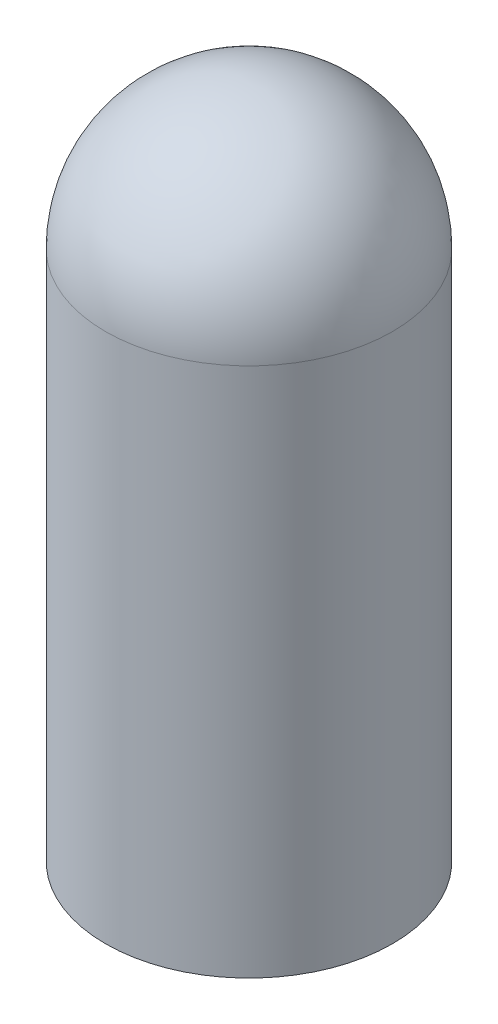
ISO-10303-21;
HEADER;
FILE_DESCRIPTION(('STEP AP214'),'2;1');
FILE_NAME('part.step','',(''),(''),'','','');
FILE_SCHEMA(('AUTOMOTIVE_DESIGN { 1 0 10303 214 1 1 1 1 }'));
ENDSEC;
DATA;
#1=APPLICATION_CONTEXT('core data for automotive mechanical design processes');
#2=APPLICATION_PROTOCOL_DEFINITION('international standard','automotive_design',2000,#1);
#3=PRODUCT_CONTEXT('',#1,'mechanical');
#4=PRODUCT('Part','Part','',(#3));
#5=PRODUCT_RELATED_PRODUCT_CATEGORY('part','',(#4));
#6=PRODUCT_DEFINITION_FORMATION('','',#4);
#7=PRODUCT_DEFINITION_CONTEXT('part definition',#1,'design');
#8=PRODUCT_DEFINITION('design','',#6,#7);
#9=PRODUCT_DEFINITION_SHAPE('','',#8);
#10=(LENGTH_UNIT() NAMED_UNIT(*) SI_UNIT(.MILLI.,.METRE.));
#11=(NAMED_UNIT(*) PLANE_ANGLE_UNIT() SI_UNIT($,.RADIAN.));
#12=(NAMED_UNIT(*) SI_UNIT($,.STERADIAN.) SOLID_ANGLE_UNIT());
#13=UNCERTAINTY_MEASURE_WITH_UNIT(LENGTH_MEASURE(1.E-05),#10,'distance_accuracy_value','');
#14=(GEOMETRIC_REPRESENTATION_CONTEXT(3) GLOBAL_UNCERTAINTY_ASSIGNED_CONTEXT((#13)) GLOBAL_UNIT_ASSIGNED_CONTEXT((#10,
#11,#12)) REPRESENTATION_CONTEXT('',''));
#15=CARTESIAN_POINT('',(0.,0.,0.));
#16=DIRECTION('',(0.,0.,1.));
#17=DIRECTION('',(1.,0.,0.));
#18=AXIS2_PLACEMENT_3D('',#15,#16,#17);
#19=CARTESIAN_POINT('',(288.897078471881,156.366473187338,0.));
#20=DIRECTION('',(0.,-1.,0.));
#21=DIRECTION('',(1.,0.,0.));
#22=AXIS2_PLACEMENT_3D('',#19,#20,#21);
#23=CYLINDRICAL_SURFACE('',#22,73.025);
#24=CARTESIAN_POINT('',(288.897078471881,426.241473187338,0.));
#25=DIRECTION('',(0.,-1.,0.));
#26=DIRECTION('',(1.,0.,0.));
#27=AXIS2_PLACEMENT_3D('',#24,#25,#26);
#28=CIRCLE('',#27,73.025);
#29=CARTESIAN_POINT('',(361.922078471881,426.241473187338,0.));
#30=VERTEX_POINT('',#29);
#31=EDGE_CURVE('E11',#30,#30,#28,.T.);
#32=ORIENTED_EDGE('',*,*,#31,.T.);
#33=EDGE_LOOP('',(#32));
#34=FACE_BOUND('',#33,.T.);
#35=CARTESIAN_POINT('',(288.897078471881,156.366473187338,0.));
#36=DIRECTION('',(0.,-1.,0.));
#37=DIRECTION('',(1.,0.,0.));
#38=AXIS2_PLACEMENT_3D('',#35,#36,#37);
#39=CIRCLE('',#38,73.025);
#40=CARTESIAN_POINT('',(361.922078471881,156.366473187338,0.));
#41=VERTEX_POINT('',#40);
#42=EDGE_CURVE('E44',#41,#41,#39,.T.);
#43=ORIENTED_EDGE('',*,*,#42,.F.);
#44=EDGE_LOOP('',(#43));
#45=FACE_BOUND('',#44,.T.);
#46=ADVANCED_FACE('F37',(#34,#45),#23,.T.);
#47=CARTESIAN_POINT('',(288.897078471881,426.241473187338,0.));
#48=DIRECTION('',(0.,-1.,0.));
#49=DIRECTION('',(1.,0.,0.));
#50=AXIS2_PLACEMENT_3D('',#47,#48,#49);
#51=SPHERICAL_SURFACE('',#50,73.025);
#52=ORIENTED_EDGE('',*,*,#31,.F.);
#53=EDGE_LOOP('',(#52));
#54=FACE_BOUND('',#53,.T.);
#55=ADVANCED_FACE('F119',(#54),#51,.T.);
#56=CARTESIAN_POINT('',(361.922078471881,156.366473187338,0.));
#57=DIRECTION('',(0.,-1.,0.));
#58=DIRECTION('',(1.,0.,0.));
#59=AXIS2_PLACEMENT_3D('',#56,#57,#58);
#60=PLANE('',#59);
#61=DIRECTION('',(0.,0.,1.));
#62=VECTOR('',#61,1.);
#63=CARTESIAN_POINT('',(318.742078471881,156.366473187338,59.055));
#64=LINE('',#63,#62);
#65=CARTESIAN_POINT('',(318.742078471881,156.366473187338,-59.055));
#66=VERTEX_POINT('',#65);
#67=CARTESIAN_POINT('',(318.742078471881,156.366473187338,59.055));
#68=VERTEX_POINT('',#67);
#69=EDGE_CURVE('E51',#66,#68,#64,.T.);
#70=ORIENTED_EDGE('',*,*,#69,.F.);
#71=DIRECTION('',(1.,0.,0.));
#72=VECTOR('',#71,1.);
#73=CARTESIAN_POINT('',(259.052078471881,156.366473187338,-59.055));
#74=LINE('',#73,#72);
#75=CARTESIAN_POINT('',(259.052078471881,156.366473187338,-59.055));
#76=VERTEX_POINT('',#75);
#77=EDGE_CURVE('E102',#76,#66,#74,.T.);
#78=ORIENTED_EDGE('',*,*,#77,.F.);
#79=DIRECTION('',(0.,0.,-1.));
#80=VECTOR('',#79,1.);
#81=CARTESIAN_POINT('',(259.052078471881,156.366473187338,59.055));
#82=LINE('',#81,#80);
#83=CARTESIAN_POINT('',(259.052078471881,156.366473187338,59.055));
#84=VERTEX_POINT('',#83);
#85=EDGE_CURVE('E108',#84,#76,#82,.T.);
#86=ORIENTED_EDGE('',*,*,#85,.F.);
#87=DIRECTION('',(-1.,0.,0.));
#88=VECTOR('',#87,1.);
#89=CARTESIAN_POINT('',(259.052078471881,156.366473187338,59.055));
#90=LINE('',#89,#88);
#91=EDGE_CURVE('E86',#68,#84,#90,.T.);
#92=ORIENTED_EDGE('',*,*,#91,.F.);
#93=EDGE_LOOP('',(#70,#78,#86,#92));
#94=FACE_BOUND('',#93,.T.);
#95=ORIENTED_EDGE('',*,*,#42,.T.);
#96=EDGE_LOOP('',(#95));
#97=FACE_BOUND('',#96,.T.);
#98=ADVANCED_FACE('F116',(#94,#97),#60,.T.);
#99=CARTESIAN_POINT('',(318.742078471881,448.466473187338,59.055));
#100=DIRECTION('',(1.,0.,0.));
#101=DIRECTION('',(0.,1.,0.));
#102=AXIS2_PLACEMENT_3D('',#99,#100,#101);
#103=PLANE('',#102);
#104=ORIENTED_EDGE('',*,*,#69,.T.);
#105=DIRECTION('',(0.,-1.,0.));
#106=VECTOR('',#105,1.);
#107=CARTESIAN_POINT('',(318.742078471881,448.466473187338,59.055));
#108=LINE('',#107,#106);
#109=CARTESIAN_POINT('',(318.742078471881,448.466473187338,59.055));
#110=VERTEX_POINT('',#109);
#111=EDGE_CURVE('E74',#110,#68,#108,.T.);
#112=ORIENTED_EDGE('',*,*,#111,.F.);
#113=DIRECTION('',(0.,0.,1.));
#114=VECTOR('',#113,1.);
#115=CARTESIAN_POINT('',(318.742078471881,448.466473187338,59.055));
#116=LINE('',#115,#114);
#117=CARTESIAN_POINT('',(318.742078471881,448.466473187338,-59.055));
#118=VERTEX_POINT('',#117);
#119=EDGE_CURVE('E100',#118,#110,#116,.T.);
#120=ORIENTED_EDGE('',*,*,#119,.F.);
#121=DIRECTION('',(0.,-1.,0.));
#122=VECTOR('',#121,1.);
#123=CARTESIAN_POINT('',(318.742078471881,448.466473187338,-59.055));
#124=LINE('',#123,#122);
#125=EDGE_CURVE('E59',#118,#66,#124,.T.);
#126=ORIENTED_EDGE('',*,*,#125,.T.);
#127=EDGE_LOOP('',(#104,#112,#120,#126));
#128=FACE_BOUND('',#127,.T.);
#129=ADVANCED_FACE('F129',(#128),#103,.F.);
#130=CARTESIAN_POINT('',(259.052078471881,448.466473187338,-59.055));
#131=DIRECTION('',(0.,0.,-1.));
#132=DIRECTION('',(-1.,0.,0.));
#133=AXIS2_PLACEMENT_3D('',#130,#131,#132);
#134=PLANE('',#133);
#135=ORIENTED_EDGE('',*,*,#77,.T.);
#136=ORIENTED_EDGE('',*,*,#125,.F.);
#137=DIRECTION('',(1.,0.,0.));
#138=VECTOR('',#137,1.);
#139=CARTESIAN_POINT('',(259.052078471881,448.466473187338,-59.055));
#140=LINE('',#139,#138);
#141=CARTESIAN_POINT('',(259.052078471881,448.466473187338,-59.055));
#142=VERTEX_POINT('',#141);
#143=EDGE_CURVE('E97',#142,#118,#140,.T.);
#144=ORIENTED_EDGE('',*,*,#143,.F.);
#145=DIRECTION('',(0.,-1.,0.));
#146=VECTOR('',#145,1.);
#147=CARTESIAN_POINT('',(259.052078471881,448.466473187338,-59.055));
#148=LINE('',#147,#146);
#149=EDGE_CURVE('E90',#142,#76,#148,.T.);
#150=ORIENTED_EDGE('',*,*,#149,.T.);
#151=EDGE_LOOP('',(#135,#136,#144,#150));
#152=FACE_BOUND('',#151,.T.);
#153=ADVANCED_FACE('F135',(#152),#134,.F.);
#154=CARTESIAN_POINT('',(259.052078471881,448.466473187338,59.055));
#155=DIRECTION('',(-1.,0.,0.));
#156=DIRECTION('',(0.,-1.,0.));
#157=AXIS2_PLACEMENT_3D('',#154,#155,#156);
#158=PLANE('',#157);
#159=ORIENTED_EDGE('',*,*,#85,.T.);
#160=ORIENTED_EDGE('',*,*,#149,.F.);
#161=DIRECTION('',(0.,0.,-1.));
#162=VECTOR('',#161,1.);
#163=CARTESIAN_POINT('',(259.052078471881,448.466473187338,59.055));
#164=LINE('',#163,#162);
#165=CARTESIAN_POINT('',(259.052078471881,448.466473187338,59.055));
#166=VERTEX_POINT('',#165);
#167=EDGE_CURVE('E93',#166,#142,#164,.T.);
#168=ORIENTED_EDGE('',*,*,#167,.F.);
#169=DIRECTION('',(0.,-1.,0.));
#170=VECTOR('',#169,1.);
#171=CARTESIAN_POINT('',(259.052078471881,448.466473187338,59.055));
#172=LINE('',#171,#170);
#173=EDGE_CURVE('E79',#166,#84,#172,.T.);
#174=ORIENTED_EDGE('',*,*,#173,.T.);
#175=EDGE_LOOP('',(#159,#160,#168,#174));
#176=FACE_BOUND('',#175,.T.);
#177=ADVANCED_FACE('F94',(#176),#158,.F.);
#178=CARTESIAN_POINT('',(259.052078471881,448.466473187338,59.055));
#179=DIRECTION('',(0.,0.,1.));
#180=DIRECTION('',(1.,0.,0.));
#181=AXIS2_PLACEMENT_3D('',#178,#179,#180);
#182=PLANE('',#181);
#183=ORIENTED_EDGE('',*,*,#91,.T.);
#184=ORIENTED_EDGE('',*,*,#173,.F.);
#185=DIRECTION('',(-1.,0.,0.));
#186=VECTOR('',#185,1.);
#187=CARTESIAN_POINT('',(259.052078471881,448.466473187338,59.055));
#188=LINE('',#187,#186);
#189=EDGE_CURVE('E83',#110,#166,#188,.T.);
#190=ORIENTED_EDGE('',*,*,#189,.F.);
#191=ORIENTED_EDGE('',*,*,#111,.T.);
#192=EDGE_LOOP('',(#183,#184,#190,#191));
#193=FACE_BOUND('',#192,.T.);
#194=ADVANCED_FACE('F81',(#193),#182,.F.);
#195=CARTESIAN_POINT('',(0.,448.466473187338,0.));
#196=DIRECTION('',(0.,-1.,0.));
#197=DIRECTION('',(0.,0.,-1.));
#198=AXIS2_PLACEMENT_3D('',#195,#196,#197);
#199=PLANE('',#198);
#200=ORIENTED_EDGE('',*,*,#119,.T.);
#201=ORIENTED_EDGE('',*,*,#189,.T.);
#202=ORIENTED_EDGE('',*,*,#167,.T.);
#203=ORIENTED_EDGE('',*,*,#143,.T.);
#204=EDGE_LOOP('',(#200,#201,#202,#203));
#205=FACE_BOUND('',#204,.T.);
#206=ADVANCED_FACE('F99',(#205),#199,.T.);
#207=CLOSED_SHELL('',(#46,#55,#98,#129,#153,#177,#194,#206));
#208=MANIFOLD_SOLID_BREP('B2',#207);
#209=ADVANCED_BREP_SHAPE_REPRESENTATION('',(#18,#208),#14);
#210=SHAPE_DEFINITION_REPRESENTATION(#9,#209);
ENDSEC;
END-ISO-10303-21;
